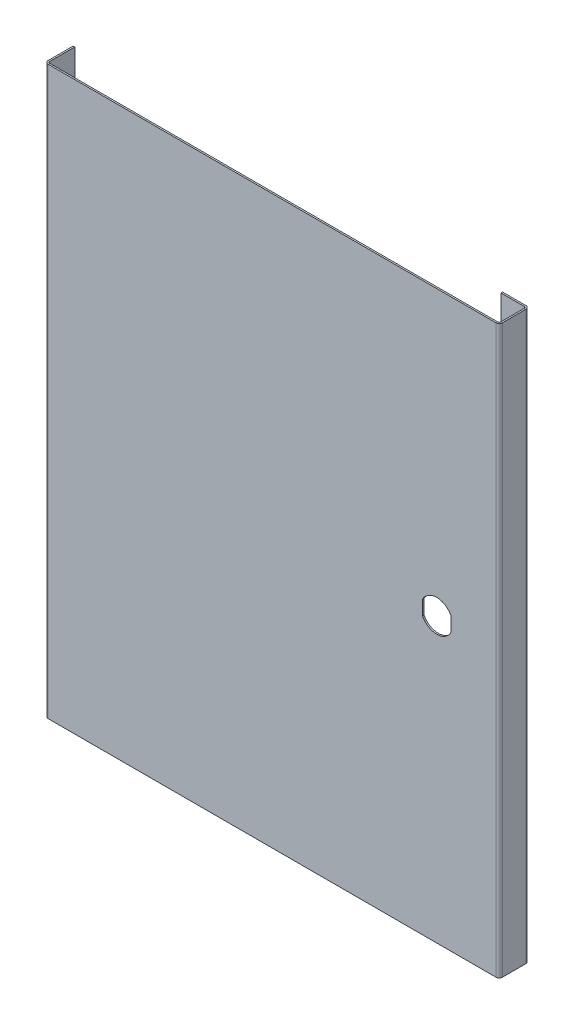
ISO-10303-21;
HEADER;
FILE_DESCRIPTION(('STEP AP214'),'2;1');
FILE_NAME('part.step','',(''),(''),'','','');
FILE_SCHEMA(('AUTOMOTIVE_DESIGN { 1 0 10303 214 1 1 1 1 }'));
ENDSEC;
DATA;
#1=APPLICATION_CONTEXT('core data for automotive mechanical design processes');
#2=APPLICATION_PROTOCOL_DEFINITION('international standard','automotive_design',2000,#1);
#3=PRODUCT_CONTEXT('',#1,'mechanical');
#4=PRODUCT('Part','Part','',(#3));
#5=PRODUCT_RELATED_PRODUCT_CATEGORY('part','',(#4));
#6=PRODUCT_DEFINITION_FORMATION('','',#4);
#7=PRODUCT_DEFINITION_CONTEXT('part definition',#1,'design');
#8=PRODUCT_DEFINITION('design','',#6,#7);
#9=PRODUCT_DEFINITION_SHAPE('','',#8);
#10=(LENGTH_UNIT() NAMED_UNIT(*) SI_UNIT(.MILLI.,.METRE.));
#11=(NAMED_UNIT(*) PLANE_ANGLE_UNIT() SI_UNIT($,.RADIAN.));
#12=(NAMED_UNIT(*) SI_UNIT($,.STERADIAN.) SOLID_ANGLE_UNIT());
#13=UNCERTAINTY_MEASURE_WITH_UNIT(LENGTH_MEASURE(1.E-05),#10,'distance_accuracy_value','');
#14=(GEOMETRIC_REPRESENTATION_CONTEXT(3) GLOBAL_UNCERTAINTY_ASSIGNED_CONTEXT((#13)) GLOBAL_UNIT_ASSIGNED_CONTEXT((#10,
#11,#12)) REPRESENTATION_CONTEXT('',''));
#15=CARTESIAN_POINT('',(0.,0.,0.));
#16=DIRECTION('',(0.,0.,1.));
#17=DIRECTION('',(1.,0.,0.));
#18=AXIS2_PLACEMENT_3D('',#15,#16,#17);
#19=CARTESIAN_POINT('',(128.25,-160.,-16.));
#20=DIRECTION('',(0.,1.,0.));
#21=DIRECTION('',(0.,0.,1.));
#22=AXIS2_PLACEMENT_3D('',#19,#20,#21);
#23=PLANE('',#22);
#24=DIRECTION('',(1.,0.,0.));
#25=VECTOR('',#24,1.);
#26=CARTESIAN_POINT('',(127.35,-160.,-15.1));
#27=LINE('',#26,#25);
#28=CARTESIAN_POINT('',(127.35,-160.,-15.1));
#29=VERTEX_POINT('',#28);
#30=CARTESIAN_POINT('',(128.25,-160.,-15.1));
#31=VERTEX_POINT('',#30);
#32=EDGE_CURVE('E289',#29,#31,#27,.T.);
#33=ORIENTED_EDGE('',*,*,#32,.T.);
#34=DIRECTION('',(0.,0.,-1.));
#35=VECTOR('',#34,1.);
#36=CARTESIAN_POINT('',(128.25,-160.,1.80520680682322E-13));
#37=LINE('',#36,#35);
#38=CARTESIAN_POINT('',(128.25,-160.,-1.79999999999999));
#39=VERTEX_POINT('',#38);
#40=EDGE_CURVE('E362',#39,#31,#37,.T.);
#41=ORIENTED_EDGE('',*,*,#40,.F.);
#42=DIRECTION('',(-1.,0.,0.));
#43=VECTOR('',#42,1.);
#44=CARTESIAN_POINT('',(127.35,-160.,-1.8));
#45=LINE('',#44,#43);
#46=CARTESIAN_POINT('',(127.35,-160.,-1.8));
#47=VERTEX_POINT('',#46);
#48=EDGE_CURVE('E372',#47,#39,#45,.F.);
#49=ORIENTED_EDGE('',*,*,#48,.F.);
#50=DIRECTION('',(0.,0.,1.));
#51=VECTOR('',#50,1.);
#52=CARTESIAN_POINT('',(127.35,-160.,-16.));
#53=LINE('',#52,#51);
#54=EDGE_CURVE('E366',#47,#29,#53,.F.);
#55=ORIENTED_EDGE('',*,*,#54,.T.);
#56=EDGE_LOOP('',(#33,#41,#49,#55));
#57=FACE_BOUND('',#56,.T.);
#58=ADVANCED_FACE('F79',(#57),#23,.F.);
#59=CARTESIAN_POINT('',(128.25,160.,-0.899999999999997));
#60=DIRECTION('',(0.,-1.,0.));
#61=DIRECTION('',(0.,0.,-1.));
#62=AXIS2_PLACEMENT_3D('',#59,#60,#61);
#63=PLANE('',#62);
#64=DIRECTION('',(1.,0.,0.));
#65=VECTOR('',#64,1.);
#66=CARTESIAN_POINT('',(127.35,160.,-15.1));
#67=LINE('',#66,#65);
#68=CARTESIAN_POINT('',(127.35,160.,-15.1));
#69=VERTEX_POINT('',#68);
#70=CARTESIAN_POINT('',(128.25,160.,-15.1));
#71=VERTEX_POINT('',#70);
#72=EDGE_CURVE('E300',#69,#71,#67,.T.);
#73=ORIENTED_EDGE('',*,*,#72,.F.);
#74=DIRECTION('',(0.,0.,-1.));
#75=VECTOR('',#74,1.);
#76=CARTESIAN_POINT('',(127.35,160.,-0.9));
#77=LINE('',#76,#75);
#78=CARTESIAN_POINT('',(127.35,160.,-1.8));
#79=VERTEX_POINT('',#78);
#80=EDGE_CURVE('E364',#69,#79,#77,.F.);
#81=ORIENTED_EDGE('',*,*,#80,.T.);
#82=DIRECTION('',(-1.,0.,0.));
#83=VECTOR('',#82,1.);
#84=CARTESIAN_POINT('',(128.25,160.,-1.79999999999999));
#85=LINE('',#84,#83);
#86=CARTESIAN_POINT('',(128.25,160.,-1.79999999999999));
#87=VERTEX_POINT('',#86);
#88=EDGE_CURVE('E356',#79,#87,#85,.F.);
#89=ORIENTED_EDGE('',*,*,#88,.T.);
#90=DIRECTION('',(0.,0.,1.));
#91=VECTOR('',#90,1.);
#92=CARTESIAN_POINT('',(128.25,160.,7.68718309622803E-13));
#93=LINE('',#92,#91);
#94=EDGE_CURVE('E359',#71,#87,#93,.T.);
#95=ORIENTED_EDGE('',*,*,#94,.F.);
#96=EDGE_LOOP('',(#73,#81,#89,#95));
#97=FACE_BOUND('',#96,.T.);
#98=ADVANCED_FACE('F468',(#97),#63,.F.);
#99=CARTESIAN_POINT('',(128.25,0.,4.74619495152562E-13));
#100=DIRECTION('',(-1.,0.,0.));
#101=DIRECTION('',(0.,0.,1.));
#102=AXIS2_PLACEMENT_3D('',#99,#100,#101);
#103=PLANE('',#102);
#104=DIRECTION('',(0.,-1.,0.));
#105=VECTOR('',#104,1.);
#106=CARTESIAN_POINT('',(128.25,-160.,-15.1));
#107=LINE('',#106,#105);
#108=EDGE_CURVE('E283',#31,#71,#107,.F.);
#109=ORIENTED_EDGE('',*,*,#108,.T.);
#110=ORIENTED_EDGE('',*,*,#94,.T.);
#111=DIRECTION('',(0.,-1.,0.));
#112=VECTOR('',#111,1.);
#113=CARTESIAN_POINT('',(128.25,160.,-1.79999999999999));
#114=LINE('',#113,#112);
#115=EDGE_CURVE('E369',#39,#87,#114,.F.);
#116=ORIENTED_EDGE('',*,*,#115,.F.);
#117=ORIENTED_EDGE('',*,*,#40,.T.);
#118=EDGE_LOOP('',(#109,#110,#116,#117));
#119=FACE_BOUND('',#118,.T.);
#120=ADVANCED_FACE('F421',(#119),#103,.F.);
#121=CARTESIAN_POINT('',(127.35,0.,4.71477161947604E-13));
#122=DIRECTION('',(-1.,0.,0.));
#123=DIRECTION('',(0.,0.,1.));
#124=AXIS2_PLACEMENT_3D('',#121,#122,#123);
#125=PLANE('',#124);
#126=ORIENTED_EDGE('',*,*,#80,.F.);
#127=DIRECTION('',(0.,-1.,0.));
#128=VECTOR('',#127,1.);
#129=CARTESIAN_POINT('',(127.35,-160.,-15.1));
#130=LINE('',#129,#128);
#131=EDGE_CURVE('E295',#29,#69,#130,.F.);
#132=ORIENTED_EDGE('',*,*,#131,.F.);
#133=ORIENTED_EDGE('',*,*,#54,.F.);
#134=DIRECTION('',(0.,-1.,0.));
#135=VECTOR('',#134,1.);
#136=CARTESIAN_POINT('',(127.35,160.,-1.8));
#137=LINE('',#136,#135);
#138=EDGE_CURVE('E375',#79,#47,#137,.T.);
#139=ORIENTED_EDGE('',*,*,#138,.F.);
#140=EDGE_LOOP('',(#126,#132,#133,#139));
#141=FACE_BOUND('',#140,.T.);
#142=ADVANCED_FACE('F494',(#141),#125,.T.);
#143=CARTESIAN_POINT('',(0.,0.,-0.9));
#144=DIRECTION('',(0.,0.,-1.));
#145=DIRECTION('',(-1.,0.,0.));
#146=AXIS2_PLACEMENT_3D('',#143,#144,#145);
#147=PLANE('',#146);
#148=CARTESIAN_POINT('',(93.,0.,-0.900000000000001));
#149=DIRECTION('',(0.,0.,-1.));
#150=DIRECTION('',(-1.,0.,0.));
#151=AXIS2_PLACEMENT_3D('',#148,#149,#150);
#152=CIRCLE('',#151,9.);
#153=CARTESIAN_POINT('',(101.,-4.12310562561761,-0.900000000000001));
#154=VERTEX_POINT('',#153);
#155=CARTESIAN_POINT('',(85.,-4.12310562561767,-0.900000000000001));
#156=VERTEX_POINT('',#155);
#157=EDGE_CURVE('E250',#154,#156,#152,.T.);
#158=ORIENTED_EDGE('',*,*,#157,.F.);
#159=DIRECTION('',(0.,-1.,0.));
#160=VECTOR('',#159,1.);
#161=CARTESIAN_POINT('',(101.,0.,-0.9));
#162=LINE('',#161,#160);
#163=CARTESIAN_POINT('',(101.,4.12310562561761,-0.9));
#164=VERTEX_POINT('',#163);
#165=EDGE_CURVE('E243',#164,#154,#162,.T.);
#166=ORIENTED_EDGE('',*,*,#165,.F.);
#167=CARTESIAN_POINT('',(93.,0.,-0.900000000000001));
#168=DIRECTION('',(0.,0.,-1.));
#169=DIRECTION('',(-1.,0.,0.));
#170=AXIS2_PLACEMENT_3D('',#167,#168,#169);
#171=CIRCLE('',#170,9.);
#172=CARTESIAN_POINT('',(85.,4.12310562561767,-0.900000000000001));
#173=VERTEX_POINT('',#172);
#174=EDGE_CURVE('E223',#173,#164,#171,.T.);
#175=ORIENTED_EDGE('',*,*,#174,.F.);
#176=DIRECTION('',(0.,1.,0.));
#177=VECTOR('',#176,1.);
#178=CARTESIAN_POINT('',(85.,0.,-0.9));
#179=LINE('',#178,#177);
#180=EDGE_CURVE('E248',#156,#173,#179,.T.);
#181=ORIENTED_EDGE('',*,*,#180,.F.);
#182=EDGE_LOOP('',(#158,#166,#175,#181));
#183=FACE_BOUND('',#182,.T.);
#184=DIRECTION('',(1.,0.,0.));
#185=VECTOR('',#184,1.);
#186=CARTESIAN_POINT('',(-128.25,-160.,-0.9));
#187=LINE('',#186,#185);
#188=CARTESIAN_POINT('',(-126.45,-160.,-0.899999999999987));
#189=VERTEX_POINT('',#188);
#190=CARTESIAN_POINT('',(126.45,-160.,-0.9));
#191=VERTEX_POINT('',#190);
#192=EDGE_CURVE('E13',#189,#191,#187,.T.);
#193=ORIENTED_EDGE('',*,*,#192,.F.);
#194=DIRECTION('',(0.,1.,0.));
#195=VECTOR('',#194,1.);
#196=CARTESIAN_POINT('',(-126.45,160.,-0.899999999999987));
#197=LINE('',#196,#195);
#198=CARTESIAN_POINT('',(-126.45,160.,-0.899999999999987));
#199=VERTEX_POINT('',#198);
#200=EDGE_CURVE('E348',#199,#189,#197,.F.);
#201=ORIENTED_EDGE('',*,*,#200,.F.);
#202=DIRECTION('',(-1.,0.,0.));
#203=VECTOR('',#202,1.);
#204=CARTESIAN_POINT('',(-128.25,160.,-0.9));
#205=LINE('',#204,#203);
#206=CARTESIAN_POINT('',(126.45,160.,-0.9));
#207=VERTEX_POINT('',#206);
#208=EDGE_CURVE('E88',#207,#199,#205,.T.);
#209=ORIENTED_EDGE('',*,*,#208,.F.);
#210=DIRECTION('',(0.,-1.,0.));
#211=VECTOR('',#210,1.);
#212=CARTESIAN_POINT('',(126.45,-160.,-0.899999999999987));
#213=LINE('',#212,#211);
#214=EDGE_CURVE('E391',#191,#207,#213,.F.);
#215=ORIENTED_EDGE('',*,*,#214,.F.);
#216=EDGE_LOOP('',(#193,#201,#209,#215));
#217=FACE_BOUND('',#216,.T.);
#218=ADVANCED_FACE('F491',(#183,#217),#147,.T.);
#219=CARTESIAN_POINT('',(0.,0.,0.));
#220=DIRECTION('',(0.,0.,-1.));
#221=DIRECTION('',(-1.,0.,0.));
#222=AXIS2_PLACEMENT_3D('',#219,#220,#221);
#223=PLANE('',#222);
#224=DIRECTION('',(0.,1.,0.));
#225=VECTOR('',#224,1.);
#226=CARTESIAN_POINT('',(101.,4.12310562561761,0.));
#227=LINE('',#226,#225);
#228=CARTESIAN_POINT('',(101.,-4.12310562561761,0.));
#229=VERTEX_POINT('',#228);
#230=CARTESIAN_POINT('',(101.,4.12310562561761,0.));
#231=VERTEX_POINT('',#230);
#232=EDGE_CURVE('E229',#229,#231,#227,.T.);
#233=ORIENTED_EDGE('',*,*,#232,.F.);
#234=CARTESIAN_POINT('',(93.,0.,0.));
#235=DIRECTION('',(0.,0.,1.));
#236=DIRECTION('',(1.,0.,0.));
#237=AXIS2_PLACEMENT_3D('',#234,#235,#236);
#238=CIRCLE('',#237,9.);
#239=CARTESIAN_POINT('',(85.,-4.12310562561767,0.));
#240=VERTEX_POINT('',#239);
#241=EDGE_CURVE('E104',#240,#229,#238,.T.);
#242=ORIENTED_EDGE('',*,*,#241,.F.);
#243=DIRECTION('',(0.,-1.,0.));
#244=VECTOR('',#243,1.);
#245=CARTESIAN_POINT('',(85.,4.12310562561767,0.));
#246=LINE('',#245,#244);
#247=CARTESIAN_POINT('',(85.,4.12310562561767,0.));
#248=VERTEX_POINT('',#247);
#249=EDGE_CURVE('E236',#248,#240,#246,.T.);
#250=ORIENTED_EDGE('',*,*,#249,.F.);
#251=CARTESIAN_POINT('',(93.,0.,0.));
#252=DIRECTION('',(0.,0.,1.));
#253=DIRECTION('',(1.,0.,0.));
#254=AXIS2_PLACEMENT_3D('',#251,#252,#253);
#255=CIRCLE('',#254,9.);
#256=EDGE_CURVE('E220',#231,#248,#255,.T.);
#257=ORIENTED_EDGE('',*,*,#256,.F.);
#258=EDGE_LOOP('',(#233,#242,#250,#257));
#259=FACE_BOUND('',#258,.T.);
#260=DIRECTION('',(0.,1.,0.));
#261=VECTOR('',#260,1.);
#262=CARTESIAN_POINT('',(-126.45,160.,0.));
#263=LINE('',#262,#261);
#264=CARTESIAN_POINT('',(-126.45,160.,0.));
#265=VERTEX_POINT('',#264);
#266=CARTESIAN_POINT('',(-126.45,-160.,0.));
#267=VERTEX_POINT('',#266);
#268=EDGE_CURVE('E336',#265,#267,#263,.F.);
#269=ORIENTED_EDGE('',*,*,#268,.T.);
#270=DIRECTION('',(1.,0.,0.));
#271=VECTOR('',#270,1.);
#272=CARTESIAN_POINT('',(-128.25,-160.,0.));
#273=LINE('',#272,#271);
#274=CARTESIAN_POINT('',(126.45,-160.,0.));
#275=VERTEX_POINT('',#274);
#276=EDGE_CURVE('E83',#267,#275,#273,.T.);
#277=ORIENTED_EDGE('',*,*,#276,.T.);
#278=DIRECTION('',(0.,-1.,0.));
#279=VECTOR('',#278,1.);
#280=CARTESIAN_POINT('',(126.45,-160.,0.));
#281=LINE('',#280,#279);
#282=CARTESIAN_POINT('',(126.45,160.,0.));
#283=VERTEX_POINT('',#282);
#284=EDGE_CURVE('E379',#275,#283,#281,.F.);
#285=ORIENTED_EDGE('',*,*,#284,.T.);
#286=DIRECTION('',(-1.,0.,0.));
#287=VECTOR('',#286,1.);
#288=CARTESIAN_POINT('',(-128.25,160.,0.));
#289=LINE('',#288,#287);
#290=EDGE_CURVE('E399',#283,#265,#289,.T.);
#291=ORIENTED_EDGE('',*,*,#290,.T.);
#292=EDGE_LOOP('',(#269,#277,#285,#291));
#293=FACE_BOUND('',#292,.T.);
#294=ADVANCED_FACE('F233',(#259,#293),#223,.F.);
#295=CARTESIAN_POINT('',(-128.25,160.,-0.9));
#296=DIRECTION('',(0.,1.,0.));
#297=DIRECTION('',(0.,0.,1.));
#298=AXIS2_PLACEMENT_3D('',#295,#296,#297);
#299=PLANE('',#298);
#300=ORIENTED_EDGE('',*,*,#208,.T.);
#301=DIRECTION('',(0.,0.,1.));
#302=VECTOR('',#301,1.);
#303=CARTESIAN_POINT('',(-126.45,160.,-0.899999999999987));
#304=LINE('',#303,#302);
#305=EDGE_CURVE('E342',#199,#265,#304,.T.);
#306=ORIENTED_EDGE('',*,*,#305,.T.);
#307=ORIENTED_EDGE('',*,*,#290,.F.);
#308=DIRECTION('',(0.,0.,1.));
#309=VECTOR('',#308,1.);
#310=CARTESIAN_POINT('',(126.45,160.,-0.899999999999987));
#311=LINE('',#310,#309);
#312=EDGE_CURVE('E396',#207,#283,#311,.T.);
#313=ORIENTED_EDGE('',*,*,#312,.F.);
#314=EDGE_LOOP('',(#300,#306,#307,#313));
#315=FACE_BOUND('',#314,.T.);
#316=ADVANCED_FACE('F81',(#315),#299,.T.);
#317=CARTESIAN_POINT('',(-128.25,-160.,-0.9));
#318=DIRECTION('',(0.,-1.,0.));
#319=DIRECTION('',(0.,0.,-1.));
#320=AXIS2_PLACEMENT_3D('',#317,#318,#319);
#321=PLANE('',#320);
#322=DIRECTION('',(0.,0.,1.));
#323=VECTOR('',#322,1.);
#324=CARTESIAN_POINT('',(-126.45,-160.,-0.899999999999987));
#325=LINE('',#324,#323);
#326=EDGE_CURVE('E353',#189,#267,#325,.T.);
#327=ORIENTED_EDGE('',*,*,#326,.F.);
#328=ORIENTED_EDGE('',*,*,#192,.T.);
#329=DIRECTION('',(0.,0.,1.));
#330=VECTOR('',#329,1.);
#331=CARTESIAN_POINT('',(126.45,-160.,-0.899999999999987));
#332=LINE('',#331,#330);
#333=EDGE_CURVE('E385',#191,#275,#332,.T.);
#334=ORIENTED_EDGE('',*,*,#333,.T.);
#335=ORIENTED_EDGE('',*,*,#276,.F.);
#336=EDGE_LOOP('',(#327,#328,#334,#335));
#337=FACE_BOUND('',#336,.T.);
#338=ADVANCED_FACE('F487',(#337),#321,.T.);
#339=CARTESIAN_POINT('',(126.45,160.,-1.8));
#340=DIRECTION('',(0.,1.,0.));
#341=DIRECTION('',(0.,0.,1.));
#342=AXIS2_PLACEMENT_3D('',#339,#340,#341);
#343=PLANE('',#342);
#344=ORIENTED_EDGE('',*,*,#88,.F.);
#345=CARTESIAN_POINT('',(126.45,160.,-1.8));
#346=DIRECTION('',(0.,-1.,0.));
#347=DIRECTION('',(0.,0.,-1.));
#348=AXIS2_PLACEMENT_3D('',#345,#346,#347);
#349=CIRCLE('',#348,0.900000000000012);
#350=EDGE_CURVE('E388',#207,#79,#349,.F.);
#351=ORIENTED_EDGE('',*,*,#350,.F.);
#352=ORIENTED_EDGE('',*,*,#312,.T.);
#353=CARTESIAN_POINT('',(126.45,160.,-1.8));
#354=DIRECTION('',(0.,-1.,0.));
#355=DIRECTION('',(0.,0.,-1.));
#356=AXIS2_PLACEMENT_3D('',#353,#354,#355);
#357=CIRCLE('',#356,1.80000000000001);
#358=EDGE_CURVE('E381',#283,#87,#357,.F.);
#359=ORIENTED_EDGE('',*,*,#358,.T.);
#360=EDGE_LOOP('',(#344,#351,#352,#359));
#361=FACE_BOUND('',#360,.T.);
#362=ADVANCED_FACE('F484',(#361),#343,.T.);
#363=CARTESIAN_POINT('',(126.45,-160.,-1.8));
#364=DIRECTION('',(0.,1.,0.));
#365=DIRECTION('',(0.,0.,1.));
#366=AXIS2_PLACEMENT_3D('',#363,#364,#365);
#367=PLANE('',#366);
#368=CARTESIAN_POINT('',(126.45,-160.,-1.8));
#369=DIRECTION('',(0.,-1.,0.));
#370=DIRECTION('',(0.,0.,-1.));
#371=AXIS2_PLACEMENT_3D('',#368,#369,#370);
#372=CIRCLE('',#371,0.900000000000012);
#373=EDGE_CURVE('E361',#47,#191,#372,.T.);
#374=ORIENTED_EDGE('',*,*,#373,.F.);
#375=ORIENTED_EDGE('',*,*,#48,.T.);
#376=CARTESIAN_POINT('',(126.45,-160.,-1.8));
#377=DIRECTION('',(0.,-1.,0.));
#378=DIRECTION('',(0.,0.,-1.));
#379=AXIS2_PLACEMENT_3D('',#376,#377,#378);
#380=CIRCLE('',#379,1.80000000000001);
#381=EDGE_CURVE('E382',#39,#275,#380,.T.);
#382=ORIENTED_EDGE('',*,*,#381,.T.);
#383=ORIENTED_EDGE('',*,*,#333,.F.);
#384=EDGE_LOOP('',(#374,#375,#382,#383));
#385=FACE_BOUND('',#384,.T.);
#386=ADVANCED_FACE('F414',(#385),#367,.F.);
#387=CARTESIAN_POINT('',(126.45,-160.,-1.8));
#388=DIRECTION('',(0.,-1.,0.));
#389=DIRECTION('',(1.,0.,0.));
#390=AXIS2_PLACEMENT_3D('',#387,#388,#389);
#391=CYLINDRICAL_SURFACE('',#390,1.80000000000001);
#392=ORIENTED_EDGE('',*,*,#284,.F.);
#393=ORIENTED_EDGE('',*,*,#381,.F.);
#394=ORIENTED_EDGE('',*,*,#115,.T.);
#395=ORIENTED_EDGE('',*,*,#358,.F.);
#396=EDGE_LOOP('',(#392,#393,#394,#395));
#397=FACE_BOUND('',#396,.T.);
#398=ADVANCED_FACE('F410',(#397),#391,.T.);
#399=CARTESIAN_POINT('',(126.45,-160.,-1.8));
#400=DIRECTION('',(0.,-1.,0.));
#401=DIRECTION('',(1.,0.,0.));
#402=AXIS2_PLACEMENT_3D('',#399,#400,#401);
#403=CYLINDRICAL_SURFACE('',#402,0.900000000000012);
#404=ORIENTED_EDGE('',*,*,#214,.T.);
#405=ORIENTED_EDGE('',*,*,#350,.T.);
#406=ORIENTED_EDGE('',*,*,#138,.T.);
#407=ORIENTED_EDGE('',*,*,#373,.T.);
#408=EDGE_LOOP('',(#404,#405,#406,#407));
#409=FACE_BOUND('',#408,.T.);
#410=ADVANCED_FACE('F479',(#409),#403,.F.);
#411=CARTESIAN_POINT('',(-126.45,-160.,-1.8));
#412=DIRECTION('',(0.,-1.,0.));
#413=DIRECTION('',(0.,0.,-1.));
#414=AXIS2_PLACEMENT_3D('',#411,#412,#413);
#415=PLANE('',#414);
#416=DIRECTION('',(1.,0.,0.));
#417=VECTOR('',#416,1.);
#418=CARTESIAN_POINT('',(-128.25,-160.,-1.79999999999999));
#419=LINE('',#418,#417);
#420=CARTESIAN_POINT('',(-127.35,-160.,-1.8));
#421=VERTEX_POINT('',#420);
#422=CARTESIAN_POINT('',(-128.25,-160.,-1.79999999999999));
#423=VERTEX_POINT('',#422);
#424=EDGE_CURVE('E303',#421,#423,#419,.F.);
#425=ORIENTED_EDGE('',*,*,#424,.F.);
#426=CARTESIAN_POINT('',(-126.45,-160.,-1.8));
#427=DIRECTION('',(0.,1.,0.));
#428=DIRECTION('',(0.,0.,1.));
#429=AXIS2_PLACEMENT_3D('',#426,#427,#428);
#430=CIRCLE('',#429,0.900000000000012);
#431=EDGE_CURVE('E345',#189,#421,#430,.F.);
#432=ORIENTED_EDGE('',*,*,#431,.F.);
#433=ORIENTED_EDGE('',*,*,#326,.T.);
#434=CARTESIAN_POINT('',(-126.45,-160.,-1.8));
#435=DIRECTION('',(0.,1.,0.));
#436=DIRECTION('',(0.,0.,1.));
#437=AXIS2_PLACEMENT_3D('',#434,#435,#436);
#438=CIRCLE('',#437,1.80000000000001);
#439=EDGE_CURVE('E338',#267,#423,#438,.F.);
#440=ORIENTED_EDGE('',*,*,#439,.T.);
#441=EDGE_LOOP('',(#425,#432,#433,#440));
#442=FACE_BOUND('',#441,.T.);
#443=ADVANCED_FACE('F482',(#442),#415,.T.);
#444=CARTESIAN_POINT('',(-126.45,160.,-1.8));
#445=DIRECTION('',(0.,-1.,0.));
#446=DIRECTION('',(0.,0.,-1.));
#447=AXIS2_PLACEMENT_3D('',#444,#445,#446);
#448=PLANE('',#447);
#449=CARTESIAN_POINT('',(-126.45,160.,-1.8));
#450=DIRECTION('',(0.,1.,0.));
#451=DIRECTION('',(0.,0.,1.));
#452=AXIS2_PLACEMENT_3D('',#449,#450,#451);
#453=CIRCLE('',#452,0.900000000000012);
#454=CARTESIAN_POINT('',(-127.35,160.,-1.8));
#455=VERTEX_POINT('',#454);
#456=EDGE_CURVE('E309',#455,#199,#453,.T.);
#457=ORIENTED_EDGE('',*,*,#456,.F.);
#458=DIRECTION('',(1.,0.,0.));
#459=VECTOR('',#458,1.);
#460=CARTESIAN_POINT('',(-127.35,160.,-1.8));
#461=LINE('',#460,#459);
#462=CARTESIAN_POINT('',(-128.25,160.,-1.79999999999999));
#463=VERTEX_POINT('',#462);
#464=EDGE_CURVE('E329',#455,#463,#461,.F.);
#465=ORIENTED_EDGE('',*,*,#464,.T.);
#466=CARTESIAN_POINT('',(-126.45,160.,-1.8));
#467=DIRECTION('',(0.,1.,0.));
#468=DIRECTION('',(0.,0.,1.));
#469=AXIS2_PLACEMENT_3D('',#466,#467,#468);
#470=CIRCLE('',#469,1.80000000000001);
#471=EDGE_CURVE('E339',#463,#265,#470,.T.);
#472=ORIENTED_EDGE('',*,*,#471,.T.);
#473=ORIENTED_EDGE('',*,*,#305,.F.);
#474=EDGE_LOOP('',(#457,#465,#472,#473));
#475=FACE_BOUND('',#474,.T.);
#476=ADVANCED_FACE('F533',(#475),#448,.F.);
#477=CARTESIAN_POINT('',(-126.45,160.,-1.8));
#478=DIRECTION('',(0.,1.,0.));
#479=DIRECTION('',(-1.,0.,0.));
#480=AXIS2_PLACEMENT_3D('',#477,#478,#479);
#481=CYLINDRICAL_SURFACE('',#480,1.80000000000001);
#482=ORIENTED_EDGE('',*,*,#268,.F.);
#483=ORIENTED_EDGE('',*,*,#471,.F.);
#484=DIRECTION('',(0.,1.,0.));
#485=VECTOR('',#484,1.);
#486=CARTESIAN_POINT('',(-128.25,-160.,-1.79999999999999));
#487=LINE('',#486,#485);
#488=EDGE_CURVE('E327',#463,#423,#487,.F.);
#489=ORIENTED_EDGE('',*,*,#488,.T.);
#490=ORIENTED_EDGE('',*,*,#439,.F.);
#491=EDGE_LOOP('',(#482,#483,#489,#490));
#492=FACE_BOUND('',#491,.T.);
#493=ADVANCED_FACE('F543',(#492),#481,.T.);
#494=CARTESIAN_POINT('',(-126.45,160.,-1.8));
#495=DIRECTION('',(0.,1.,0.));
#496=DIRECTION('',(-1.,0.,0.));
#497=AXIS2_PLACEMENT_3D('',#494,#495,#496);
#498=CYLINDRICAL_SURFACE('',#497,0.900000000000012);
#499=ORIENTED_EDGE('',*,*,#200,.T.);
#500=ORIENTED_EDGE('',*,*,#431,.T.);
#501=DIRECTION('',(0.,1.,0.));
#502=VECTOR('',#501,1.);
#503=CARTESIAN_POINT('',(-127.35,-160.,-1.8));
#504=LINE('',#503,#502);
#505=EDGE_CURVE('E332',#421,#455,#504,.T.);
#506=ORIENTED_EDGE('',*,*,#505,.T.);
#507=ORIENTED_EDGE('',*,*,#456,.T.);
#508=EDGE_LOOP('',(#499,#500,#506,#507));
#509=FACE_BOUND('',#508,.T.);
#510=ADVANCED_FACE('F510',(#509),#498,.F.);
#511=CARTESIAN_POINT('',(-128.25,160.,-16.));
#512=DIRECTION('',(0.,-1.,0.));
#513=DIRECTION('',(0.,0.,-1.));
#514=AXIS2_PLACEMENT_3D('',#511,#512,#513);
#515=PLANE('',#514);
#516=ORIENTED_EDGE('',*,*,#464,.F.);
#517=DIRECTION('',(0.,0.,1.));
#518=VECTOR('',#517,1.);
#519=CARTESIAN_POINT('',(-127.35,160.,-16.));
#520=LINE('',#519,#518);
#521=CARTESIAN_POINT('',(-127.35,160.,-16.));
#522=VERTEX_POINT('',#521);
#523=EDGE_CURVE('E325',#455,#522,#520,.F.);
#524=ORIENTED_EDGE('',*,*,#523,.T.);
#525=DIRECTION('',(1.,0.,0.));
#526=VECTOR('',#525,1.);
#527=CARTESIAN_POINT('',(-128.25,160.,-16.));
#528=LINE('',#527,#526);
#529=CARTESIAN_POINT('',(-128.25,160.,-16.));
#530=VERTEX_POINT('',#529);
#531=EDGE_CURVE('E306',#530,#522,#528,.T.);
#532=ORIENTED_EDGE('',*,*,#531,.F.);
#533=DIRECTION('',(0.,0.,-1.));
#534=VECTOR('',#533,1.);
#535=CARTESIAN_POINT('',(-128.25,160.,7.68718309622803E-13));
#536=LINE('',#535,#534);
#537=EDGE_CURVE('E318',#463,#530,#536,.T.);
#538=ORIENTED_EDGE('',*,*,#537,.F.);
#539=EDGE_LOOP('',(#516,#524,#532,#538));
#540=FACE_BOUND('',#539,.T.);
#541=ADVANCED_FACE('F535',(#540),#515,.F.);
#542=CARTESIAN_POINT('',(-128.25,-160.,-0.899999999999997));
#543=DIRECTION('',(0.,1.,0.));
#544=DIRECTION('',(0.,0.,1.));
#545=AXIS2_PLACEMENT_3D('',#542,#543,#544);
#546=PLANE('',#545);
#547=ORIENTED_EDGE('',*,*,#424,.T.);
#548=DIRECTION('',(0.,0.,1.));
#549=VECTOR('',#548,1.);
#550=CARTESIAN_POINT('',(-128.25,-160.,1.80520680682322E-13));
#551=LINE('',#550,#549);
#552=CARTESIAN_POINT('',(-128.25,-160.,-16.));
#553=VERTEX_POINT('',#552);
#554=EDGE_CURVE('E313',#553,#423,#551,.T.);
#555=ORIENTED_EDGE('',*,*,#554,.F.);
#556=DIRECTION('',(1.,0.,0.));
#557=VECTOR('',#556,1.);
#558=CARTESIAN_POINT('',(-128.25,-160.,-16.));
#559=LINE('',#558,#557);
#560=CARTESIAN_POINT('',(-127.35,-160.,-16.));
#561=VERTEX_POINT('',#560);
#562=EDGE_CURVE('E310',#553,#561,#559,.T.);
#563=ORIENTED_EDGE('',*,*,#562,.T.);
#564=DIRECTION('',(0.,0.,-1.));
#565=VECTOR('',#564,1.);
#566=CARTESIAN_POINT('',(-127.35,-160.,-0.9));
#567=LINE('',#566,#565);
#568=EDGE_CURVE('E320',#561,#421,#567,.F.);
#569=ORIENTED_EDGE('',*,*,#568,.T.);
#570=EDGE_LOOP('',(#547,#555,#563,#569));
#571=FACE_BOUND('',#570,.T.);
#572=ADVANCED_FACE('F515',(#571),#546,.F.);
#573=CARTESIAN_POINT('',(-128.25,0.,4.74619495152562E-13));
#574=DIRECTION('',(1.,0.,0.));
#575=DIRECTION('',(0.,0.,-1.));
#576=AXIS2_PLACEMENT_3D('',#573,#574,#575);
#577=PLANE('',#576);
#578=ORIENTED_EDGE('',*,*,#488,.F.);
#579=ORIENTED_EDGE('',*,*,#537,.T.);
#580=DIRECTION('',(0.,-1.,0.));
#581=VECTOR('',#580,1.);
#582=CARTESIAN_POINT('',(-128.25,0.,-16.));
#583=LINE('',#582,#581);
#584=EDGE_CURVE('E316',#530,#553,#583,.T.);
#585=ORIENTED_EDGE('',*,*,#584,.T.);
#586=ORIENTED_EDGE('',*,*,#554,.T.);
#587=EDGE_LOOP('',(#578,#579,#585,#586));
#588=FACE_BOUND('',#587,.T.);
#589=ADVANCED_FACE('F519',(#588),#577,.F.);
#590=CARTESIAN_POINT('',(-127.35,0.,4.71477161947604E-13));
#591=DIRECTION('',(1.,0.,0.));
#592=DIRECTION('',(0.,0.,-1.));
#593=AXIS2_PLACEMENT_3D('',#590,#591,#592);
#594=PLANE('',#593);
#595=ORIENTED_EDGE('',*,*,#523,.F.);
#596=ORIENTED_EDGE('',*,*,#505,.F.);
#597=ORIENTED_EDGE('',*,*,#568,.F.);
#598=DIRECTION('',(0.,1.,0.));
#599=VECTOR('',#598,1.);
#600=CARTESIAN_POINT('',(-127.35,-160.,-16.));
#601=LINE('',#600,#599);
#602=EDGE_CURVE('E323',#522,#561,#601,.F.);
#603=ORIENTED_EDGE('',*,*,#602,.F.);
#604=EDGE_LOOP('',(#595,#596,#597,#603));
#605=FACE_BOUND('',#604,.T.);
#606=ADVANCED_FACE('F529',(#605),#594,.T.);
#607=CARTESIAN_POINT('',(-128.25,-160.,-16.));
#608=DIRECTION('',(0.,0.,1.));
#609=DIRECTION('',(1.,0.,0.));
#610=AXIS2_PLACEMENT_3D('',#607,#608,#609);
#611=PLANE('',#610);
#612=ORIENTED_EDGE('',*,*,#602,.T.);
#613=ORIENTED_EDGE('',*,*,#562,.F.);
#614=ORIENTED_EDGE('',*,*,#584,.F.);
#615=ORIENTED_EDGE('',*,*,#531,.T.);
#616=EDGE_LOOP('',(#612,#613,#614,#615));
#617=FACE_BOUND('',#616,.T.);
#618=ADVANCED_FACE('F525',(#617),#611,.F.);
#619=CARTESIAN_POINT('',(126.45,160.,-15.1));
#620=DIRECTION('',(0.,1.,0.));
#621=DIRECTION('',(0.,0.,1.));
#622=AXIS2_PLACEMENT_3D('',#619,#620,#621);
#623=PLANE('',#622);
#624=DIRECTION('',(0.,0.,-1.));
#625=VECTOR('',#624,1.);
#626=CARTESIAN_POINT('',(126.45,160.,-16.));
#627=LINE('',#626,#625);
#628=CARTESIAN_POINT('',(126.45,160.,-16.));
#629=VERTEX_POINT('',#628);
#630=CARTESIAN_POINT('',(126.45,160.,-16.9));
#631=VERTEX_POINT('',#630);
#632=EDGE_CURVE('E252',#629,#631,#627,.T.);
#633=ORIENTED_EDGE('',*,*,#632,.F.);
#634=CARTESIAN_POINT('',(126.45,160.,-15.1));
#635=DIRECTION('',(0.,-1.,0.));
#636=DIRECTION('',(0.,0.,-1.));
#637=AXIS2_PLACEMENT_3D('',#634,#635,#636);
#638=CIRCLE('',#637,0.899999999999998);
#639=EDGE_CURVE('E292',#69,#629,#638,.F.);
#640=ORIENTED_EDGE('',*,*,#639,.F.);
#641=ORIENTED_EDGE('',*,*,#72,.T.);
#642=CARTESIAN_POINT('',(126.45,160.,-15.1));
#643=DIRECTION('',(0.,-1.,0.));
#644=DIRECTION('',(0.,0.,-1.));
#645=AXIS2_PLACEMENT_3D('',#642,#643,#644);
#646=CIRCLE('',#645,1.8);
#647=EDGE_CURVE('E285',#71,#631,#646,.F.);
#648=ORIENTED_EDGE('',*,*,#647,.T.);
#649=EDGE_LOOP('',(#633,#640,#641,#648));
#650=FACE_BOUND('',#649,.T.);
#651=ADVANCED_FACE('F451',(#650),#623,.T.);
#652=CARTESIAN_POINT('',(126.45,-160.,-15.1));
#653=DIRECTION('',(0.,1.,0.));
#654=DIRECTION('',(0.,0.,1.));
#655=AXIS2_PLACEMENT_3D('',#652,#653,#654);
#656=PLANE('',#655);
#657=CARTESIAN_POINT('',(126.45,-160.,-15.1));
#658=DIRECTION('',(0.,-1.,0.));
#659=DIRECTION('',(0.,0.,-1.));
#660=AXIS2_PLACEMENT_3D('',#657,#658,#659);
#661=CIRCLE('',#660,0.899999999999998);
#662=CARTESIAN_POINT('',(126.45,-160.,-16.));
#663=VERTEX_POINT('',#662);
#664=EDGE_CURVE('E282',#663,#29,#661,.T.);
#665=ORIENTED_EDGE('',*,*,#664,.F.);
#666=DIRECTION('',(0.,0.,-1.));
#667=VECTOR('',#666,1.);
#668=CARTESIAN_POINT('',(126.45,-160.,-16.));
#669=LINE('',#668,#667);
#670=CARTESIAN_POINT('',(126.45,-160.,-16.9));
#671=VERTEX_POINT('',#670);
#672=EDGE_CURVE('E255',#663,#671,#669,.T.);
#673=ORIENTED_EDGE('',*,*,#672,.T.);
#674=CARTESIAN_POINT('',(126.45,-160.,-15.1));
#675=DIRECTION('',(0.,-1.,0.));
#676=DIRECTION('',(0.,0.,-1.));
#677=AXIS2_PLACEMENT_3D('',#674,#675,#676);
#678=CIRCLE('',#677,1.8);
#679=EDGE_CURVE('E286',#671,#31,#678,.T.);
#680=ORIENTED_EDGE('',*,*,#679,.T.);
#681=ORIENTED_EDGE('',*,*,#32,.F.);
#682=EDGE_LOOP('',(#665,#673,#680,#681));
#683=FACE_BOUND('',#682,.T.);
#684=ADVANCED_FACE('F430',(#683),#656,.F.);
#685=CARTESIAN_POINT('',(126.45,-160.,-15.1));
#686=DIRECTION('',(0.,-1.,0.));
#687=DIRECTION('',(0.,0.,-1.));
#688=AXIS2_PLACEMENT_3D('',#685,#686,#687);
#689=CYLINDRICAL_SURFACE('',#688,1.8);
#690=ORIENTED_EDGE('',*,*,#108,.F.);
#691=ORIENTED_EDGE('',*,*,#679,.F.);
#692=DIRECTION('',(0.,1.,0.));
#693=VECTOR('',#692,1.);
#694=CARTESIAN_POINT('',(126.45,0.,-16.9));
#695=LINE('',#694,#693);
#696=EDGE_CURVE('E258',#671,#631,#695,.T.);
#697=ORIENTED_EDGE('',*,*,#696,.T.);
#698=ORIENTED_EDGE('',*,*,#647,.F.);
#699=EDGE_LOOP('',(#690,#691,#697,#698));
#700=FACE_BOUND('',#699,.T.);
#701=ADVANCED_FACE('F429',(#700),#689,.T.);
#702=CARTESIAN_POINT('',(126.45,-160.,-15.1));
#703=DIRECTION('',(0.,-1.,0.));
#704=DIRECTION('',(0.,0.,-1.));
#705=AXIS2_PLACEMENT_3D('',#702,#703,#704);
#706=CYLINDRICAL_SURFACE('',#705,0.899999999999998);
#707=ORIENTED_EDGE('',*,*,#131,.T.);
#708=ORIENTED_EDGE('',*,*,#639,.T.);
#709=DIRECTION('',(0.,-1.,0.));
#710=VECTOR('',#709,1.);
#711=CARTESIAN_POINT('',(126.45,160.,-16.));
#712=LINE('',#711,#710);
#713=EDGE_CURVE('E253',#629,#663,#712,.T.);
#714=ORIENTED_EDGE('',*,*,#713,.T.);
#715=ORIENTED_EDGE('',*,*,#664,.T.);
#716=EDGE_LOOP('',(#707,#708,#714,#715));
#717=FACE_BOUND('',#716,.T.);
#718=ADVANCED_FACE('F454',(#717),#706,.F.);
#719=CARTESIAN_POINT('',(113.25,-160.,-16.9000000000001));
#720=DIRECTION('',(0.,1.,0.));
#721=DIRECTION('',(0.,0.,1.));
#722=AXIS2_PLACEMENT_3D('',#719,#720,#721);
#723=PLANE('',#722);
#724=ORIENTED_EDGE('',*,*,#672,.F.);
#725=DIRECTION('',(-1.,0.,0.));
#726=VECTOR('',#725,1.);
#727=CARTESIAN_POINT('',(113.25,-160.,-16.0000000000001));
#728=LINE('',#727,#726);
#729=CARTESIAN_POINT('',(113.25,-160.,-16.0000000000001));
#730=VERTEX_POINT('',#729);
#731=EDGE_CURVE('E262',#663,#730,#728,.T.);
#732=ORIENTED_EDGE('',*,*,#731,.T.);
#733=DIRECTION('',(0.,0.,1.));
#734=VECTOR('',#733,1.);
#735=CARTESIAN_POINT('',(113.25,-160.,-16.9000000000001));
#736=LINE('',#735,#734);
#737=CARTESIAN_POINT('',(113.25,-160.,-16.9000000000001));
#738=VERTEX_POINT('',#737);
#739=EDGE_CURVE('E279',#738,#730,#736,.T.);
#740=ORIENTED_EDGE('',*,*,#739,.F.);
#741=DIRECTION('',(-1.,0.,0.));
#742=VECTOR('',#741,1.);
#743=CARTESIAN_POINT('',(113.25,-160.,-16.9000000000001));
#744=LINE('',#743,#742);
#745=EDGE_CURVE('E263',#671,#738,#744,.T.);
#746=ORIENTED_EDGE('',*,*,#745,.F.);
#747=EDGE_LOOP('',(#724,#732,#740,#746));
#748=FACE_BOUND('',#747,.T.);
#749=ADVANCED_FACE('F441',(#748),#723,.F.);
#750=CARTESIAN_POINT('',(127.35,160.,-16.9));
#751=DIRECTION('',(0.,-1.,0.));
#752=DIRECTION('',(0.,0.,-1.));
#753=AXIS2_PLACEMENT_3D('',#750,#751,#752);
#754=PLANE('',#753);
#755=ORIENTED_EDGE('',*,*,#632,.T.);
#756=DIRECTION('',(1.,0.,0.));
#757=VECTOR('',#756,1.);
#758=CARTESIAN_POINT('',(127.35,160.,-16.9));
#759=LINE('',#758,#757);
#760=CARTESIAN_POINT('',(113.25,160.,-16.9000000000001));
#761=VERTEX_POINT('',#760);
#762=EDGE_CURVE('E268',#761,#631,#759,.T.);
#763=ORIENTED_EDGE('',*,*,#762,.F.);
#764=DIRECTION('',(0.,0.,1.));
#765=VECTOR('',#764,1.);
#766=CARTESIAN_POINT('',(113.25,160.,-16.9000000000001));
#767=LINE('',#766,#765);
#768=CARTESIAN_POINT('',(113.25,160.,-16.0000000000001));
#769=VERTEX_POINT('',#768);
#770=EDGE_CURVE('E271',#761,#769,#767,.T.);
#771=ORIENTED_EDGE('',*,*,#770,.T.);
#772=DIRECTION('',(1.,0.,0.));
#773=VECTOR('',#772,1.);
#774=CARTESIAN_POINT('',(127.35,160.,-16.));
#775=LINE('',#774,#773);
#776=EDGE_CURVE('E266',#769,#629,#775,.T.);
#777=ORIENTED_EDGE('',*,*,#776,.T.);
#778=EDGE_LOOP('',(#755,#763,#771,#777));
#779=FACE_BOUND('',#778,.T.);
#780=ADVANCED_FACE('F448',(#779),#754,.F.);
#781=CARTESIAN_POINT('',(1.20622816194456E-13,0.,-16.9000000000009));
#782=DIRECTION('',(0.,0.,1.));
#783=DIRECTION('',(1.,0.,0.));
#784=AXIS2_PLACEMENT_3D('',#781,#782,#783);
#785=PLANE('',#784);
#786=ORIENTED_EDGE('',*,*,#696,.F.);
#787=ORIENTED_EDGE('',*,*,#745,.T.);
#788=DIRECTION('',(0.,1.,0.));
#789=VECTOR('',#788,1.);
#790=CARTESIAN_POINT('',(113.25,160.,-16.9000000000001));
#791=LINE('',#790,#789);
#792=EDGE_CURVE('E265',#738,#761,#791,.T.);
#793=ORIENTED_EDGE('',*,*,#792,.T.);
#794=ORIENTED_EDGE('',*,*,#762,.T.);
#795=EDGE_LOOP('',(#786,#787,#793,#794));
#796=FACE_BOUND('',#795,.T.);
#797=ADVANCED_FACE('F437',(#796),#785,.F.);
#798=CARTESIAN_POINT('',(1.14171871326707E-13,0.,-16.0000000000009));
#799=DIRECTION('',(0.,0.,1.));
#800=DIRECTION('',(1.,0.,0.));
#801=AXIS2_PLACEMENT_3D('',#798,#799,#800);
#802=PLANE('',#801);
#803=ORIENTED_EDGE('',*,*,#731,.F.);
#804=ORIENTED_EDGE('',*,*,#713,.F.);
#805=ORIENTED_EDGE('',*,*,#776,.F.);
#806=DIRECTION('',(0.,1.,0.));
#807=VECTOR('',#806,1.);
#808=CARTESIAN_POINT('',(113.25,160.,-16.0000000000001));
#809=LINE('',#808,#807);
#810=EDGE_CURVE('E273',#730,#769,#809,.T.);
#811=ORIENTED_EDGE('',*,*,#810,.F.);
#812=EDGE_LOOP('',(#803,#804,#805,#811));
#813=FACE_BOUND('',#812,.T.);
#814=ADVANCED_FACE('F456',(#813),#802,.T.);
#815=CARTESIAN_POINT('',(113.25,160.,-16.9000000000001));
#816=DIRECTION('',(1.,0.,0.));
#817=DIRECTION('',(0.,0.,-1.));
#818=AXIS2_PLACEMENT_3D('',#815,#816,#817);
#819=PLANE('',#818);
#820=ORIENTED_EDGE('',*,*,#810,.T.);
#821=ORIENTED_EDGE('',*,*,#770,.F.);
#822=ORIENTED_EDGE('',*,*,#792,.F.);
#823=ORIENTED_EDGE('',*,*,#739,.T.);
#824=EDGE_LOOP('',(#820,#821,#822,#823));
#825=FACE_BOUND('',#824,.T.);
#826=ADVANCED_FACE('F444',(#825),#819,.F.);
#827=CARTESIAN_POINT('',(93.,0.,-16.9000000000001));
#828=DIRECTION('',(0.,0.,1.));
#829=DIRECTION('',(1.,0.,0.));
#830=AXIS2_PLACEMENT_3D('',#827,#828,#829);
#831=CYLINDRICAL_SURFACE('',#830,9.);
#832=ORIENTED_EDGE('',*,*,#157,.T.);
#833=DIRECTION('',(0.,0.,1.));
#834=VECTOR('',#833,1.);
#835=CARTESIAN_POINT('',(85.,-4.12310562561767,-16.9000000000001));
#836=LINE('',#835,#834);
#837=EDGE_CURVE('E241',#156,#240,#836,.T.);
#838=ORIENTED_EDGE('',*,*,#837,.T.);
#839=ORIENTED_EDGE('',*,*,#241,.T.);
#840=DIRECTION('',(0.,0.,1.));
#841=VECTOR('',#840,1.);
#842=CARTESIAN_POINT('',(101.,-4.12310562561761,-16.9000000000001));
#843=LINE('',#842,#841);
#844=EDGE_CURVE('E226',#154,#229,#843,.T.);
#845=ORIENTED_EDGE('',*,*,#844,.F.);
#846=EDGE_LOOP('',(#832,#838,#839,#845));
#847=FACE_BOUND('',#846,.T.);
#848=ADVANCED_FACE('F463',(#847),#831,.F.);
#849=CARTESIAN_POINT('',(85.,4.12310562561767,-16.9000000000001));
#850=DIRECTION('',(-1.,0.,0.));
#851=DIRECTION('',(0.,0.,1.));
#852=AXIS2_PLACEMENT_3D('',#849,#850,#851);
#853=PLANE('',#852);
#854=ORIENTED_EDGE('',*,*,#180,.T.);
#855=DIRECTION('',(0.,0.,1.));
#856=VECTOR('',#855,1.);
#857=CARTESIAN_POINT('',(85.,4.12310562561767,-16.9000000000001));
#858=LINE('',#857,#856);
#859=EDGE_CURVE('E225',#173,#248,#858,.T.);
#860=ORIENTED_EDGE('',*,*,#859,.T.);
#861=ORIENTED_EDGE('',*,*,#249,.T.);
#862=ORIENTED_EDGE('',*,*,#837,.F.);
#863=EDGE_LOOP('',(#854,#860,#861,#862));
#864=FACE_BOUND('',#863,.T.);
#865=ADVANCED_FACE('F808',(#864),#853,.F.);
#866=CARTESIAN_POINT('',(93.,0.,-16.9000000000001));
#867=DIRECTION('',(0.,0.,1.));
#868=DIRECTION('',(1.,0.,0.));
#869=AXIS2_PLACEMENT_3D('',#866,#867,#868);
#870=CYLINDRICAL_SURFACE('',#869,9.);
#871=ORIENTED_EDGE('',*,*,#174,.T.);
#872=DIRECTION('',(0.,0.,1.));
#873=VECTOR('',#872,1.);
#874=CARTESIAN_POINT('',(101.,4.12310562561761,-16.9000000000001));
#875=LINE('',#874,#873);
#876=EDGE_CURVE('E96',#164,#231,#875,.T.);
#877=ORIENTED_EDGE('',*,*,#876,.T.);
#878=ORIENTED_EDGE('',*,*,#256,.T.);
#879=ORIENTED_EDGE('',*,*,#859,.F.);
#880=EDGE_LOOP('',(#871,#877,#878,#879));
#881=FACE_BOUND('',#880,.T.);
#882=ADVANCED_FACE('F217',(#881),#870,.F.);
#883=CARTESIAN_POINT('',(101.,4.12310562561761,-16.9000000000001));
#884=DIRECTION('',(1.,0.,0.));
#885=DIRECTION('',(0.,0.,-1.));
#886=AXIS2_PLACEMENT_3D('',#883,#884,#885);
#887=PLANE('',#886);
#888=ORIENTED_EDGE('',*,*,#165,.T.);
#889=ORIENTED_EDGE('',*,*,#844,.T.);
#890=ORIENTED_EDGE('',*,*,#232,.T.);
#891=ORIENTED_EDGE('',*,*,#876,.F.);
#892=EDGE_LOOP('',(#888,#889,#890,#891));
#893=FACE_BOUND('',#892,.T.);
#894=ADVANCED_FACE('F230',(#893),#887,.F.);
#895=CLOSED_SHELL('',(#58,#98,#120,#142,#218,#294,#316,#338,#362,#386,#398,#410,#443,#476,#493,
#510,#541,#572,#589,#606,#618,#651,#684,#701,#718,#749,#780,#797,#814,#826,#848,#865,#882,#894));
#896=MANIFOLD_SOLID_BREP('B2',#895);
#897=ADVANCED_BREP_SHAPE_REPRESENTATION('',(#18,#896),#14);
#898=SHAPE_DEFINITION_REPRESENTATION(#9,#897);
ENDSEC;
END-ISO-10303-21;
